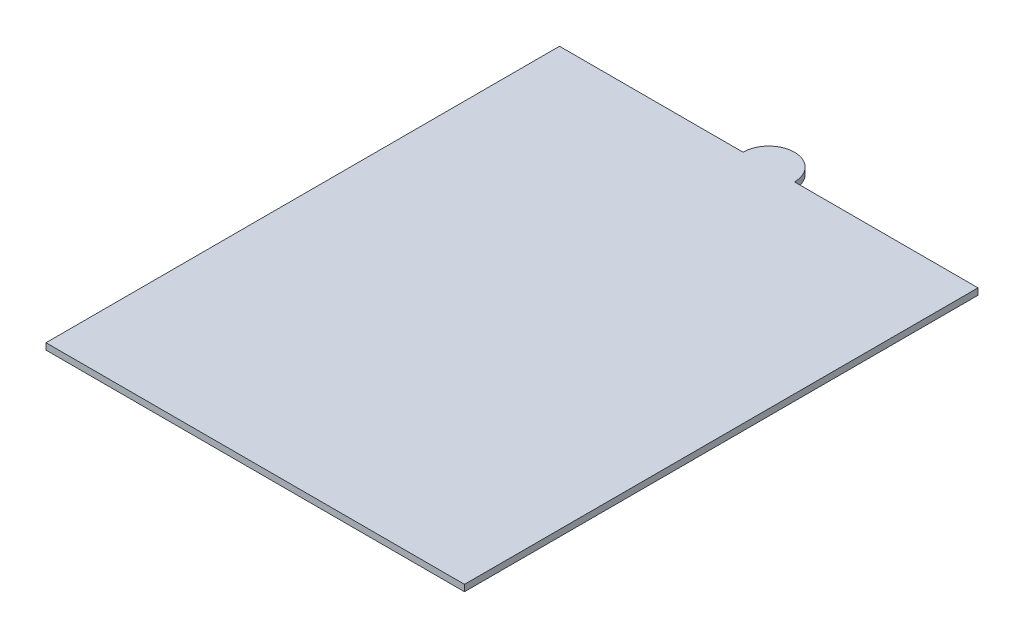
ISO-10303-21;
HEADER;
FILE_DESCRIPTION(('STEP AP214'),'2;1');
FILE_NAME('part.step','',(''),(''),'','','');
FILE_SCHEMA(('AUTOMOTIVE_DESIGN { 1 0 10303 214 1 1 1 1 }'));
ENDSEC;
DATA;
#1=APPLICATION_CONTEXT('core data for automotive mechanical design processes');
#2=APPLICATION_PROTOCOL_DEFINITION('international standard','automotive_design',2000,#1);
#3=PRODUCT_CONTEXT('',#1,'mechanical');
#4=PRODUCT('Part','Part','',(#3));
#5=PRODUCT_RELATED_PRODUCT_CATEGORY('part','',(#4));
#6=PRODUCT_DEFINITION_FORMATION('','',#4);
#7=PRODUCT_DEFINITION_CONTEXT('part definition',#1,'design');
#8=PRODUCT_DEFINITION('design','',#6,#7);
#9=PRODUCT_DEFINITION_SHAPE('','',#8);
#10=(LENGTH_UNIT() NAMED_UNIT(*) SI_UNIT(.MILLI.,.METRE.));
#11=(NAMED_UNIT(*) PLANE_ANGLE_UNIT() SI_UNIT($,.RADIAN.));
#12=(NAMED_UNIT(*) SI_UNIT($,.STERADIAN.) SOLID_ANGLE_UNIT());
#13=UNCERTAINTY_MEASURE_WITH_UNIT(LENGTH_MEASURE(1.E-05),#10,'distance_accuracy_value','');
#14=(GEOMETRIC_REPRESENTATION_CONTEXT(3) GLOBAL_UNCERTAINTY_ASSIGNED_CONTEXT((#13)) GLOBAL_UNIT_ASSIGNED_CONTEXT((#10,
#11,#12)) REPRESENTATION_CONTEXT('',''));
#15=CARTESIAN_POINT('',(0.,0.,0.));
#16=DIRECTION('',(0.,0.,1.));
#17=DIRECTION('',(1.,0.,0.));
#18=AXIS2_PLACEMENT_3D('',#15,#16,#17);
#19=CARTESIAN_POINT('',(103.1875,3.175,126.619));
#20=DIRECTION('',(-1.,0.,0.));
#21=DIRECTION('',(0.,0.,1.));
#22=AXIS2_PLACEMENT_3D('',#19,#20,#21);
#23=PLANE('',#22);
#24=DIRECTION('',(0.,0.,-1.));
#25=VECTOR('',#24,1.);
#26=CARTESIAN_POINT('',(103.1875,0.,126.619));
#27=LINE('',#26,#25);
#28=CARTESIAN_POINT('',(103.1875,0.,126.619));
#29=VERTEX_POINT('',#28);
#30=CARTESIAN_POINT('',(103.1875,0.,-126.619));
#31=VERTEX_POINT('',#30);
#32=EDGE_CURVE('E128',#29,#31,#27,.T.);
#33=ORIENTED_EDGE('',*,*,#32,.T.);
#34=DIRECTION('',(0.,-1.,0.));
#35=VECTOR('',#34,1.);
#36=CARTESIAN_POINT('',(103.1875,3.175,-126.619));
#37=LINE('',#36,#35);
#38=CARTESIAN_POINT('',(103.1875,3.175,-126.619));
#39=VERTEX_POINT('',#38);
#40=EDGE_CURVE('E11',#39,#31,#37,.T.);
#41=ORIENTED_EDGE('',*,*,#40,.F.);
#42=DIRECTION('',(0.,0.,-1.));
#43=VECTOR('',#42,1.);
#44=CARTESIAN_POINT('',(103.1875,3.175,126.619));
#45=LINE('',#44,#43);
#46=CARTESIAN_POINT('',(103.1875,3.175,126.619));
#47=VERTEX_POINT('',#46);
#48=EDGE_CURVE('E144',#47,#39,#45,.T.);
#49=ORIENTED_EDGE('',*,*,#48,.F.);
#50=DIRECTION('',(0.,-1.,0.));
#51=VECTOR('',#50,1.);
#52=CARTESIAN_POINT('',(103.1875,3.175,126.619));
#53=LINE('',#52,#51);
#54=EDGE_CURVE('E124',#47,#29,#53,.T.);
#55=ORIENTED_EDGE('',*,*,#54,.T.);
#56=EDGE_LOOP('',(#33,#41,#49,#55));
#57=FACE_BOUND('',#56,.T.);
#58=ADVANCED_FACE('F39',(#57),#23,.F.);
#59=CARTESIAN_POINT('',(12.7,3.175,-126.619));
#60=DIRECTION('',(0.,0.,1.));
#61=DIRECTION('',(1.,0.,0.));
#62=AXIS2_PLACEMENT_3D('',#59,#60,#61);
#63=PLANE('',#62);
#64=DIRECTION('',(-1.,0.,0.));
#65=VECTOR('',#64,1.);
#66=CARTESIAN_POINT('',(12.7,0.,-126.619));
#67=LINE('',#66,#65);
#68=CARTESIAN_POINT('',(12.7,0.,-126.619));
#69=VERTEX_POINT('',#68);
#70=EDGE_CURVE('E132',#31,#69,#67,.T.);
#71=ORIENTED_EDGE('',*,*,#70,.T.);
#72=DIRECTION('',(0.,-1.,0.));
#73=VECTOR('',#72,1.);
#74=CARTESIAN_POINT('',(12.7,3.175,-126.619));
#75=LINE('',#74,#73);
#76=CARTESIAN_POINT('',(12.7,3.175,-126.619));
#77=VERTEX_POINT('',#76);
#78=EDGE_CURVE('E48',#77,#69,#75,.T.);
#79=ORIENTED_EDGE('',*,*,#78,.F.);
#80=DIRECTION('',(-1.,0.,0.));
#81=VECTOR('',#80,1.);
#82=CARTESIAN_POINT('',(12.7,3.175,-126.619));
#83=LINE('',#82,#81);
#84=EDGE_CURVE('E93',#39,#77,#83,.T.);
#85=ORIENTED_EDGE('',*,*,#84,.F.);
#86=ORIENTED_EDGE('',*,*,#40,.T.);
#87=EDGE_LOOP('',(#71,#79,#85,#86));
#88=FACE_BOUND('',#87,.T.);
#89=ADVANCED_FACE('F172',(#88),#63,.F.);
#90=CARTESIAN_POINT('',(0.,3.175,-126.619));
#91=DIRECTION('',(0.,-1.,0.));
#92=DIRECTION('',(0.,0.,-1.));
#93=AXIS2_PLACEMENT_3D('',#90,#91,#92);
#94=CYLINDRICAL_SURFACE('',#93,12.7);
#95=CARTESIAN_POINT('',(0.,0.,-126.619));
#96=DIRECTION('',(0.,1.,0.));
#97=DIRECTION('',(0.,0.,1.));
#98=AXIS2_PLACEMENT_3D('',#95,#96,#97);
#99=CIRCLE('',#98,12.7);
#100=CARTESIAN_POINT('',(-12.7,0.,-126.619));
#101=VERTEX_POINT('',#100);
#102=EDGE_CURVE('E135',#69,#101,#99,.T.);
#103=ORIENTED_EDGE('',*,*,#102,.T.);
#104=DIRECTION('',(0.,-1.,0.));
#105=VECTOR('',#104,1.);
#106=CARTESIAN_POINT('',(-12.7,3.175,-126.619));
#107=LINE('',#106,#105);
#108=CARTESIAN_POINT('',(-12.7,3.175,-126.619));
#109=VERTEX_POINT('',#108);
#110=EDGE_CURVE('E117',#109,#101,#107,.T.);
#111=ORIENTED_EDGE('',*,*,#110,.F.);
#112=CARTESIAN_POINT('',(0.,3.175,-126.619));
#113=DIRECTION('',(0.,1.,0.));
#114=DIRECTION('',(0.,0.,1.));
#115=AXIS2_PLACEMENT_3D('',#112,#113,#114);
#116=CIRCLE('',#115,12.7);
#117=EDGE_CURVE('E106',#77,#109,#116,.T.);
#118=ORIENTED_EDGE('',*,*,#117,.F.);
#119=ORIENTED_EDGE('',*,*,#78,.T.);
#120=EDGE_LOOP('',(#103,#111,#118,#119));
#121=FACE_BOUND('',#120,.T.);
#122=ADVANCED_FACE('F154',(#121),#94,.T.);
#123=CARTESIAN_POINT('',(-103.1875,3.175,-126.619));
#124=DIRECTION('',(0.,0.,1.));
#125=DIRECTION('',(1.,0.,0.));
#126=AXIS2_PLACEMENT_3D('',#123,#124,#125);
#127=PLANE('',#126);
#128=DIRECTION('',(-1.,0.,0.));
#129=VECTOR('',#128,1.);
#130=CARTESIAN_POINT('',(-103.1875,0.,-126.619));
#131=LINE('',#130,#129);
#132=CARTESIAN_POINT('',(-103.1875,0.,-126.619));
#133=VERTEX_POINT('',#132);
#134=EDGE_CURVE('E115',#101,#133,#131,.T.);
#135=ORIENTED_EDGE('',*,*,#134,.T.);
#136=DIRECTION('',(0.,-1.,0.));
#137=VECTOR('',#136,1.);
#138=CARTESIAN_POINT('',(-103.1875,3.175,-126.619));
#139=LINE('',#138,#137);
#140=CARTESIAN_POINT('',(-103.1875,3.175,-126.619));
#141=VERTEX_POINT('',#140);
#142=EDGE_CURVE('E112',#141,#133,#139,.T.);
#143=ORIENTED_EDGE('',*,*,#142,.F.);
#144=DIRECTION('',(-1.,0.,0.));
#145=VECTOR('',#144,1.);
#146=CARTESIAN_POINT('',(-103.1875,3.175,-126.619));
#147=LINE('',#146,#145);
#148=EDGE_CURVE('E100',#109,#141,#147,.T.);
#149=ORIENTED_EDGE('',*,*,#148,.F.);
#150=ORIENTED_EDGE('',*,*,#110,.T.);
#151=EDGE_LOOP('',(#135,#143,#149,#150));
#152=FACE_BOUND('',#151,.T.);
#153=ADVANCED_FACE('F113',(#152),#127,.F.);
#154=CARTESIAN_POINT('',(-103.1875,3.175,126.619));
#155=DIRECTION('',(1.,0.,0.));
#156=DIRECTION('',(0.,0.,-1.));
#157=AXIS2_PLACEMENT_3D('',#154,#155,#156);
#158=PLANE('',#157);
#159=DIRECTION('',(0.,0.,1.));
#160=VECTOR('',#159,1.);
#161=CARTESIAN_POINT('',(-103.1875,0.,126.619));
#162=LINE('',#161,#160);
#163=CARTESIAN_POINT('',(-103.1875,0.,126.619));
#164=VERTEX_POINT('',#163);
#165=EDGE_CURVE('E79',#133,#164,#162,.T.);
#166=ORIENTED_EDGE('',*,*,#165,.T.);
#167=DIRECTION('',(0.,-1.,0.));
#168=VECTOR('',#167,1.);
#169=CARTESIAN_POINT('',(-103.1875,3.175,126.619));
#170=LINE('',#169,#168);
#171=CARTESIAN_POINT('',(-103.1875,3.175,126.619));
#172=VERTEX_POINT('',#171);
#173=EDGE_CURVE('E118',#172,#164,#170,.T.);
#174=ORIENTED_EDGE('',*,*,#173,.F.);
#175=DIRECTION('',(0.,0.,1.));
#176=VECTOR('',#175,1.);
#177=CARTESIAN_POINT('',(-103.1875,3.175,126.619));
#178=LINE('',#177,#176);
#179=EDGE_CURVE('E104',#141,#172,#178,.T.);
#180=ORIENTED_EDGE('',*,*,#179,.F.);
#181=ORIENTED_EDGE('',*,*,#142,.T.);
#182=EDGE_LOOP('',(#166,#174,#180,#181));
#183=FACE_BOUND('',#182,.T.);
#184=ADVANCED_FACE('F120',(#183),#158,.F.);
#185=CARTESIAN_POINT('',(-103.1875,3.175,126.619));
#186=DIRECTION('',(0.,0.,-1.));
#187=DIRECTION('',(-1.,0.,0.));
#188=AXIS2_PLACEMENT_3D('',#185,#186,#187);
#189=PLANE('',#188);
#190=DIRECTION('',(1.,0.,0.));
#191=VECTOR('',#190,1.);
#192=CARTESIAN_POINT('',(-103.1875,0.,126.619));
#193=LINE('',#192,#191);
#194=EDGE_CURVE('E85',#164,#29,#193,.T.);
#195=ORIENTED_EDGE('',*,*,#194,.T.);
#196=ORIENTED_EDGE('',*,*,#54,.F.);
#197=DIRECTION('',(1.,0.,0.));
#198=VECTOR('',#197,1.);
#199=CARTESIAN_POINT('',(-103.1875,3.175,126.619));
#200=LINE('',#199,#198);
#201=EDGE_CURVE('E56',#172,#47,#200,.T.);
#202=ORIENTED_EDGE('',*,*,#201,.F.);
#203=ORIENTED_EDGE('',*,*,#173,.T.);
#204=EDGE_LOOP('',(#195,#196,#202,#203));
#205=FACE_BOUND('',#204,.T.);
#206=ADVANCED_FACE('F161',(#205),#189,.F.);
#207=CARTESIAN_POINT('',(0.,3.175,-126.619));
#208=DIRECTION('',(0.,1.,0.));
#209=DIRECTION('',(0.,0.,1.));
#210=AXIS2_PLACEMENT_3D('',#207,#208,#209);
#211=PLANE('',#210);
#212=ORIENTED_EDGE('',*,*,#48,.T.);
#213=ORIENTED_EDGE('',*,*,#84,.T.);
#214=ORIENTED_EDGE('',*,*,#117,.T.);
#215=ORIENTED_EDGE('',*,*,#148,.T.);
#216=ORIENTED_EDGE('',*,*,#179,.T.);
#217=ORIENTED_EDGE('',*,*,#201,.T.);
#218=EDGE_LOOP('',(#212,#213,#214,#215,#216,#217));
#219=FACE_BOUND('',#218,.T.);
#220=ADVANCED_FACE('F102',(#219),#211,.T.);
#221=CARTESIAN_POINT('',(0.,0.,-126.619));
#222=DIRECTION('',(0.,1.,0.));
#223=DIRECTION('',(0.,0.,1.));
#224=AXIS2_PLACEMENT_3D('',#221,#222,#223);
#225=PLANE('',#224);
#226=ORIENTED_EDGE('',*,*,#32,.F.);
#227=ORIENTED_EDGE('',*,*,#194,.F.);
#228=ORIENTED_EDGE('',*,*,#165,.F.);
#229=ORIENTED_EDGE('',*,*,#134,.F.);
#230=ORIENTED_EDGE('',*,*,#102,.F.);
#231=ORIENTED_EDGE('',*,*,#70,.F.);
#232=EDGE_LOOP('',(#226,#227,#228,#229,#230,#231));
#233=FACE_BOUND('',#232,.T.);
#234=ADVANCED_FACE('F157',(#233),#225,.F.);
#235=CLOSED_SHELL('',(#58,#89,#122,#153,#184,#206,#220,#234));
#236=MANIFOLD_SOLID_BREP('B2',#235);
#237=ADVANCED_BREP_SHAPE_REPRESENTATION('',(#18,#236),#14);
#238=SHAPE_DEFINITION_REPRESENTATION(#9,#237);
ENDSEC;
END-ISO-10303-21;
